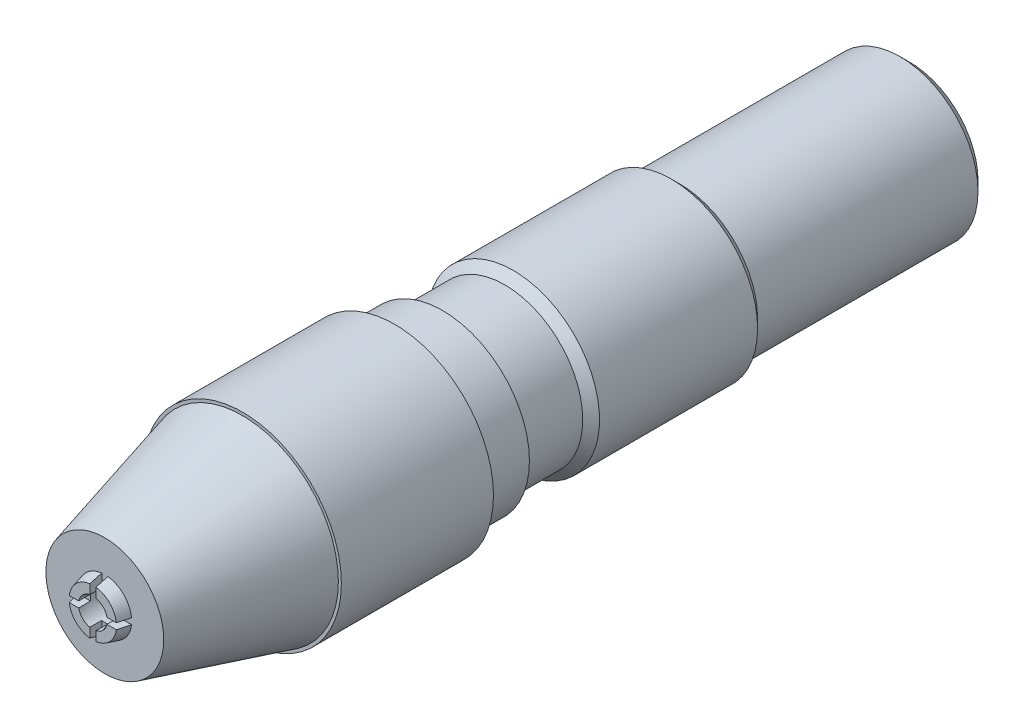
ISO-10303-21;
HEADER;
FILE_DESCRIPTION(('STEP AP214'),'2;1');
FILE_NAME('part.step','',(''),(''),'','','');
FILE_SCHEMA(('AUTOMOTIVE_DESIGN { 1 0 10303 214 1 1 1 1 }'));
ENDSEC;
DATA;
#1=APPLICATION_CONTEXT('core data for automotive mechanical design processes');
#2=APPLICATION_PROTOCOL_DEFINITION('international standard','automotive_design',2000,#1);
#3=PRODUCT_CONTEXT('',#1,'mechanical');
#4=PRODUCT('Part','Part','',(#3));
#5=PRODUCT_RELATED_PRODUCT_CATEGORY('part','',(#4));
#6=PRODUCT_DEFINITION_FORMATION('','',#4);
#7=PRODUCT_DEFINITION_CONTEXT('part definition',#1,'design');
#8=PRODUCT_DEFINITION('design','',#6,#7);
#9=PRODUCT_DEFINITION_SHAPE('','',#8);
#10=(LENGTH_UNIT() NAMED_UNIT(*) SI_UNIT(.MILLI.,.METRE.));
#11=(NAMED_UNIT(*) PLANE_ANGLE_UNIT() SI_UNIT($,.RADIAN.));
#12=(NAMED_UNIT(*) SI_UNIT($,.STERADIAN.) SOLID_ANGLE_UNIT());
#13=UNCERTAINTY_MEASURE_WITH_UNIT(LENGTH_MEASURE(1.E-05),#10,'distance_accuracy_value','');
#14=(GEOMETRIC_REPRESENTATION_CONTEXT(3) GLOBAL_UNCERTAINTY_ASSIGNED_CONTEXT((#13)) GLOBAL_UNIT_ASSIGNED_CONTEXT((#10,
#11,#12)) REPRESENTATION_CONTEXT('',''));
#15=CARTESIAN_POINT('',(0.,0.,0.));
#16=DIRECTION('',(0.,0.,1.));
#17=DIRECTION('',(1.,0.,0.));
#18=AXIS2_PLACEMENT_3D('',#15,#16,#17);
#19=CARTESIAN_POINT('',(0.,0.,33.6));
#20=DIRECTION('',(0.,0.,-1.));
#21=DIRECTION('',(1.,0.,0.));
#22=AXIS2_PLACEMENT_3D('',#19,#20,#21);
#23=CONICAL_SURFACE('',#22,1.125,0.26179938779915);
#24=CARTESIAN_POINT('',(1.52694377281968,0.127,32.0802486933022));
#25=CARTESIAN_POINT('',(1.45227874622724,0.127,32.3579168634142));
#26=CARTESIAN_POINT('',(1.3775911679959,0.127,32.6355789898778));
#27=CARTESIAN_POINT('',(1.22809970511908,0.127,33.1908716971153));
#28=CARTESIAN_POINT('',(1.15329582056319,0.127,33.4685022779133));
#29=CARTESIAN_POINT('',(1.00350036372481,0.127,34.0237130981265));
#30=CARTESIAN_POINT('',(0.928508791283457,0.127,34.3012933374989));
#31=CARTESIAN_POINT('',(0.815735396256075,0.127,34.7175863820948));
#32=CARTESIAN_POINT('',(0.778096576825201,0.127,34.856337899722));
#33=CARTESIAN_POINT('',(0.702661835456821,0.127,35.1337982869867));
#34=CARTESIAN_POINT('',(0.664865913438249,0.127,35.2725071566022));
#35=CARTESIAN_POINT('',(0.62696057606872,0.127,35.4111862107595));
#36=B_SPLINE_CURVE_WITH_KNOTS('',3,(#24,#25,#26,#27,#28,#29,#30,#31,#32,#33,#34,#35),
.UNSPECIFIED.,.F.,.F.,(4,2,2,2,2,4),(0.,0.862595128116384,1.72518959207756,2.58778478643162,
3.01908272670163,3.45038088955431),.UNSPECIFIED.);
#37=CARTESIAN_POINT('',(1.1178085703733,0.127,33.6));
#38=VERTEX_POINT('',#37);
#39=CARTESIAN_POINT('',(0.982854186004266,0.127,34.1));
#40=VERTEX_POINT('',#39);
#41=EDGE_CURVE('E456',#38,#40,#36,.T.);
#42=ORIENTED_EDGE('',*,*,#41,.F.);
#43=CARTESIAN_POINT('',(0.,0.,33.6));
#44=DIRECTION('',(0.,0.,1.));
#45=DIRECTION('',(1.,0.,0.));
#46=AXIS2_PLACEMENT_3D('',#43,#44,#45);
#47=CIRCLE('',#46,1.125);
#48=CARTESIAN_POINT('',(0.127,1.1178085703733,33.6));
#49=VERTEX_POINT('',#48);
#50=EDGE_CURVE('E273',#38,#49,#47,.T.);
#51=ORIENTED_EDGE('',*,*,#50,.T.);
#52=CARTESIAN_POINT('',(0.127,0.601834770500935,35.5030149332084));
#53=CARTESIAN_POINT('',(0.127,0.644839569806814,35.3459199452708));
#54=CARTESIAN_POINT('',(0.127,0.687692951729256,35.1887836667116));
#55=CARTESIAN_POINT('',(0.127,0.773188124812799,34.8744536668195));
#56=CARTESIAN_POINT('',(0.127,0.815829916137058,34.7172599455311));
#57=CARTESIAN_POINT('',(0.127,0.917802220550908,34.3407816957723));
#58=CARTESIAN_POINT('',(0.127,0.977075881718677,34.1214817837702));
#59=CARTESIAN_POINT('',(0.127,1.10833509558951,33.6352591502015));
#60=CARTESIAN_POINT('',(0.127,1.18028831663031,33.3683277037445));
#61=CARTESIAN_POINT('',(0.127,1.32407353817755,32.8344323970499));
#62=CARTESIAN_POINT('',(0.127,1.3959055387851,32.5674685368395));
#63=CARTESIAN_POINT('',(0.127,1.46771592416519,32.3004989030254));
#64=B_SPLINE_CURVE_WITH_KNOTS('',3,(#52,#53,#54,#55,#56,#57,#58,#59,#60,#61,#62,#63),
.UNSPECIFIED.,.F.,.F.,(4,2,2,2,2,4),(0.,0.488624543896328,0.977248710951746,1.65875607166697,
2.48813349090421,3.31751021817905),.UNSPECIFIED.);
#65=CARTESIAN_POINT('',(0.127,0.982854186004266,34.1));
#66=VERTEX_POINT('',#65);
#67=EDGE_CURVE('E439',#66,#49,#64,.T.);
#68=ORIENTED_EDGE('',*,*,#67,.F.);
#69=CARTESIAN_POINT('',(0.,0.,34.1));
#70=DIRECTION('',(0.,0.,1.));
#71=DIRECTION('',(1.,0.,0.));
#72=AXIS2_PLACEMENT_3D('',#69,#70,#71);
#73=CIRCLE('',#72,0.991025403784438);
#74=EDGE_CURVE('E280',#40,#66,#73,.T.);
#75=ORIENTED_EDGE('',*,*,#74,.F.);
#76=EDGE_LOOP('',(#42,#51,#68,#75));
#77=FACE_BOUND('',#76,.T.);
#78=ADVANCED_FACE('F38',(#77),#23,.T.);
#79=CARTESIAN_POINT('',(0.,0.,34.1));
#80=DIRECTION('',(0.,0.,1.));
#81=DIRECTION('',(1.,0.,0.));
#82=AXIS2_PLACEMENT_3D('',#79,#80,#81);
#83=PLANE('',#82);
#84=CARTESIAN_POINT('',(0.,0.,34.1));
#85=DIRECTION('',(0.,0.,1.));
#86=DIRECTION('',(1.,0.,0.));
#87=AXIS2_PLACEMENT_3D('',#84,#85,#86);
#88=CIRCLE('',#87,0.602413808335125);
#89=CARTESIAN_POINT('',(0.127,0.588874686561435,34.1));
#90=VERTEX_POINT('',#89);
#91=CARTESIAN_POINT('',(0.588874686561435,0.127,34.1));
#92=VERTEX_POINT('',#91);
#93=EDGE_CURVE('E176',#90,#92,#88,.F.);
#94=ORIENTED_EDGE('',*,*,#93,.T.);
#95=DIRECTION('',(1.,0.,0.));
#96=VECTOR('',#95,1.);
#97=CARTESIAN_POINT('',(-2.08035132850745,0.127,34.1));
#98=LINE('',#97,#96);
#99=EDGE_CURVE('E342',#92,#40,#98,.T.);
#100=ORIENTED_EDGE('',*,*,#99,.T.);
#101=ORIENTED_EDGE('',*,*,#74,.T.);
#102=DIRECTION('',(0.,-1.,0.));
#103=VECTOR('',#102,1.);
#104=CARTESIAN_POINT('',(0.127,0.,34.1));
#105=LINE('',#104,#103);
#106=EDGE_CURVE('E181',#66,#90,#105,.T.);
#107=ORIENTED_EDGE('',*,*,#106,.T.);
#108=EDGE_LOOP('',(#94,#100,#101,#107));
#109=FACE_BOUND('',#108,.T.);
#110=ADVANCED_FACE('F224',(#109),#83,.T.);
#111=CARTESIAN_POINT('',(-0.62696057606872,0.127,35.4111862107595));
#112=CARTESIAN_POINT('',(-0.671617188551801,0.127,35.2477882704118));
#113=CARTESIAN_POINT('',(-0.716128755964168,0.127,35.0843508302516));
#114=CARTESIAN_POINT('',(-0.804949111535813,0.127,34.7574209544264));
#115=CARTESIAN_POINT('',(-0.849257899827911,0.127,34.5939285187975));
#116=CARTESIAN_POINT('',(-0.955235062396902,0.127,34.2023422186737));
#117=CARTESIAN_POINT('',(-1.01684886147507,0.127,33.9742335976866));
#118=CARTESIAN_POINT('',(-1.15329704633582,0.127,33.4685023975448));
#119=CARTESIAN_POINT('',(-1.22810040088634,0.127,33.1908714489486));
#120=CARTESIAN_POINT('',(-1.37759069314615,0.127,32.6355784167316));
#121=CARTESIAN_POINT('',(-1.45227763093794,0.127,32.3579163331329));
#122=CARTESIAN_POINT('',(-1.52694377281968,0.127,32.0802486933022));
#123=B_SPLINE_CURVE_WITH_KNOTS('',3,(#111,#112,#113,#114,#115,#116,#117,#118,#119,#120,#121,
#122),.UNSPECIFIED.,.F.,.F.,(4,2,2,2,2,4),(0.,0.508170873106861,1.01634141331268,
1.72519129378873,2.58778639562883,3.45038088586624),.UNSPECIFIED.);
#124=CARTESIAN_POINT('',(-0.982854186004266,0.127,34.1));
#125=VERTEX_POINT('',#124);
#126=CARTESIAN_POINT('',(-1.1178085703733,0.127,33.6));
#127=VERTEX_POINT('',#126);
#128=EDGE_CURVE('E466',#125,#127,#123,.T.);
#129=ORIENTED_EDGE('',*,*,#128,.F.);
#130=CARTESIAN_POINT('',(-0.127,0.982854186004266,34.1));
#131=VERTEX_POINT('',#130);
#132=EDGE_CURVE('E287',#131,#125,#73,.T.);
#133=ORIENTED_EDGE('',*,*,#132,.F.);
#134=CARTESIAN_POINT('',(-0.127,0.601834770500935,35.5030149332084));
#135=CARTESIAN_POINT('',(-0.127,0.644839569806814,35.3459199452708));
#136=CARTESIAN_POINT('',(-0.127,0.687692951729256,35.1887836667116));
#137=CARTESIAN_POINT('',(-0.127,0.773188124812799,34.8744536668195));
#138=CARTESIAN_POINT('',(-0.127,0.815829916137058,34.7172599455311));
#139=CARTESIAN_POINT('',(-0.127,0.917802220550908,34.3407816957723));
#140=CARTESIAN_POINT('',(-0.127,0.977075881718677,34.1214817837702));
#141=CARTESIAN_POINT('',(-0.127,1.10833509558951,33.6352591502015));
#142=CARTESIAN_POINT('',(-0.127,1.18028831663031,33.3683277037445));
#143=CARTESIAN_POINT('',(-0.127,1.32407353817755,32.8344323970499));
#144=CARTESIAN_POINT('',(-0.127,1.3959055387851,32.5674685368395));
#145=CARTESIAN_POINT('',(-0.127,1.46771592416519,32.3004989030254));
#146=B_SPLINE_CURVE_WITH_KNOTS('',3,(#134,#135,#136,#137,#138,#139,#140,#141,#142,#143,#144,
#145),.UNSPECIFIED.,.F.,.F.,(4,2,2,2,2,4),(0.,0.488624543896328,0.977248710951746,
1.65875607166697,2.48813349090421,3.31751021817905),.UNSPECIFIED.);
#147=CARTESIAN_POINT('',(-0.127,1.1178085703733,33.6));
#148=VERTEX_POINT('',#147);
#149=EDGE_CURVE('E67',#131,#148,#146,.T.);
#150=ORIENTED_EDGE('',*,*,#149,.T.);
#151=EDGE_CURVE('E275',#148,#127,#47,.T.);
#152=ORIENTED_EDGE('',*,*,#151,.T.);
#153=EDGE_LOOP('',(#129,#133,#150,#152));
#154=FACE_BOUND('',#153,.T.);
#155=ADVANCED_FACE('F227',(#154),#23,.T.);
#156=CARTESIAN_POINT('',(-0.588874686561435,0.127,34.1));
#157=VERTEX_POINT('',#156);
#158=CARTESIAN_POINT('',(-0.127,0.588874686561435,34.1));
#159=VERTEX_POINT('',#158);
#160=EDGE_CURVE('E334',#157,#159,#88,.F.);
#161=ORIENTED_EDGE('',*,*,#160,.T.);
#162=DIRECTION('',(0.,-1.,0.));
#163=VECTOR('',#162,1.);
#164=CARTESIAN_POINT('',(-0.127,0.,34.1));
#165=LINE('',#164,#163);
#166=EDGE_CURVE('E182',#131,#159,#165,.T.);
#167=ORIENTED_EDGE('',*,*,#166,.F.);
#168=ORIENTED_EDGE('',*,*,#132,.T.);
#169=EDGE_CURVE('E344',#125,#157,#98,.T.);
#170=ORIENTED_EDGE('',*,*,#169,.T.);
#171=EDGE_LOOP('',(#161,#167,#168,#170));
#172=FACE_BOUND('',#171,.T.);
#173=ADVANCED_FACE('F234',(#172),#83,.T.);
#174=CARTESIAN_POINT('',(0.127,2.18502309346412,28.9090568149624));
#175=DIRECTION('',(-1.,0.,0.));
#176=DIRECTION('',(0.,0.,1.));
#177=AXIS2_PLACEMENT_3D('',#174,#175,#176);
#178=PLANE('',#177);
#179=CARTESIAN_POINT('',(0.127,0.580651528027783,35.0208133824793));
#180=CARTESIAN_POINT('',(0.127,0.584160501595592,34.6280050532015));
#181=CARTESIAN_POINT('',(0.127,0.587668098484079,34.2351967116354));
#182=CARTESIAN_POINT('',(0.127,0.594635244174312,33.4546544563337));
#183=CARTESIAN_POINT('',(0.127,0.59809482831528,33.0669205429136));
#184=CARTESIAN_POINT('',(0.127,0.601553071116144,32.6791866175207));
#185=B_SPLINE_CURVE_WITH_KNOTS('',3,(#179,#180,#181,#182,#183,#184),.UNSPECIFIED.,.F.,.F.,(4,2,
4),(0.,1.17847200558975,2.34172004751647),.UNSPECIFIED.);
#186=CARTESIAN_POINT('',(0.127,0.593337696163707,33.6));
#187=VERTEX_POINT('',#186);
#188=EDGE_CURVE('E346',#90,#187,#185,.T.);
#189=ORIENTED_EDGE('',*,*,#188,.F.);
#190=ORIENTED_EDGE('',*,*,#106,.F.);
#191=ORIENTED_EDGE('',*,*,#67,.T.);
#192=DIRECTION('',(0.,1.,0.));
#193=VECTOR('',#192,1.);
#194=CARTESIAN_POINT('',(0.127,2.18502309346412,33.6));
#195=LINE('',#194,#193);
#196=EDGE_CURVE('E453',#187,#49,#195,.T.);
#197=ORIENTED_EDGE('',*,*,#196,.F.);
#198=EDGE_LOOP('',(#189,#190,#191,#197));
#199=FACE_BOUND('',#198,.T.);
#200=ADVANCED_FACE('F262',(#199),#178,.T.);
#201=CARTESIAN_POINT('',(-0.127,2.18502309346412,28.9090568149624));
#202=DIRECTION('',(-1.,0.,0.));
#203=DIRECTION('',(0.,0.,1.));
#204=AXIS2_PLACEMENT_3D('',#201,#202,#203);
#205=PLANE('',#204);
#206=ORIENTED_EDGE('',*,*,#166,.T.);
#207=CARTESIAN_POINT('',(-0.127,0.580651528027783,35.0208133824793));
#208=CARTESIAN_POINT('',(-0.127,0.584160501595592,34.6280050532015));
#209=CARTESIAN_POINT('',(-0.127,0.587668098484079,34.2351967116354));
#210=CARTESIAN_POINT('',(-0.127,0.594635244174312,33.4546544563337));
#211=CARTESIAN_POINT('',(-0.127,0.59809482831528,33.0669205429136));
#212=CARTESIAN_POINT('',(-0.127,0.601553071116144,32.6791866175207));
#213=B_SPLINE_CURVE_WITH_KNOTS('',3,(#207,#208,#209,#210,#211,#212),.UNSPECIFIED.,.F.,.F.,(4,2,
4),(0.,1.17847200558975,2.34172004751647),.UNSPECIFIED.);
#214=CARTESIAN_POINT('',(-0.127,0.593337696163707,33.6));
#215=VERTEX_POINT('',#214);
#216=EDGE_CURVE('E412',#159,#215,#213,.T.);
#217=ORIENTED_EDGE('',*,*,#216,.T.);
#218=DIRECTION('',(0.,1.,0.));
#219=VECTOR('',#218,1.);
#220=CARTESIAN_POINT('',(-0.127,2.18502309346412,33.6));
#221=LINE('',#220,#219);
#222=EDGE_CURVE('E465',#215,#148,#221,.T.);
#223=ORIENTED_EDGE('',*,*,#222,.T.);
#224=ORIENTED_EDGE('',*,*,#149,.F.);
#225=EDGE_LOOP('',(#206,#217,#223,#224));
#226=FACE_BOUND('',#225,.T.);
#227=ADVANCED_FACE('F255',(#226),#205,.F.);
#228=CARTESIAN_POINT('',(0.127,-1.1178085703733,33.6));
#229=VERTEX_POINT('',#228);
#230=CARTESIAN_POINT('',(1.1178085703733,-0.127,33.6));
#231=VERTEX_POINT('',#230);
#232=EDGE_CURVE('E268',#229,#231,#47,.T.);
#233=ORIENTED_EDGE('',*,*,#232,.T.);
#234=CARTESIAN_POINT('',(1.52694377281968,-0.127,32.0802486933022));
#235=CARTESIAN_POINT('',(1.45227874622724,-0.127,32.3579168634142));
#236=CARTESIAN_POINT('',(1.3775911679959,-0.127,32.6355789898778));
#237=CARTESIAN_POINT('',(1.22809970511908,-0.127,33.1908716971153));
#238=CARTESIAN_POINT('',(1.15329582056319,-0.127,33.4685022779133));
#239=CARTESIAN_POINT('',(1.00350036372481,-0.127,34.0237130981265));
#240=CARTESIAN_POINT('',(0.928508791283457,-0.127,34.3012933374989));
#241=CARTESIAN_POINT('',(0.815735396256075,-0.127,34.7175863820948));
#242=CARTESIAN_POINT('',(0.778096576825201,-0.127,34.856337899722));
#243=CARTESIAN_POINT('',(0.702661835456821,-0.127,35.1337982869867));
#244=CARTESIAN_POINT('',(0.664865913438249,-0.127,35.2725071566022));
#245=CARTESIAN_POINT('',(0.62696057606872,-0.127,35.4111862107595));
#246=B_SPLINE_CURVE_WITH_KNOTS('',3,(#234,#235,#236,#237,#238,#239,#240,#241,#242,#243,#244,
#245),.UNSPECIFIED.,.F.,.F.,(4,2,2,2,2,4),(0.,0.862595128116384,1.72518959207756,
2.58778478643162,3.01908272670163,3.45038088955431),.UNSPECIFIED.);
#247=CARTESIAN_POINT('',(0.982854186004266,-0.127,34.1));
#248=VERTEX_POINT('',#247);
#249=EDGE_CURVE('E269',#231,#248,#246,.T.);
#250=ORIENTED_EDGE('',*,*,#249,.T.);
#251=CARTESIAN_POINT('',(0.127,-0.982854186004266,34.1));
#252=VERTEX_POINT('',#251);
#253=EDGE_CURVE('E283',#252,#248,#73,.T.);
#254=ORIENTED_EDGE('',*,*,#253,.F.);
#255=CARTESIAN_POINT('',(0.127,-1.46771592416519,32.3004989030254));
#256=CARTESIAN_POINT('',(0.127,-1.39590669999338,32.5674691096526));
#257=CARTESIAN_POINT('',(0.127,-1.3240740251528,32.834433031674));
#258=CARTESIAN_POINT('',(0.127,-1.1802875798174,33.3683279976573));
#259=CARTESIAN_POINT('',(0.127,-1.10833380943221,33.6352590416487));
#260=CARTESIAN_POINT('',(0.127,-0.964230777253068,34.1690686917328));
#261=CARTESIAN_POINT('',(0.127,-0.892081515264477,34.4359472977731));
#262=CARTESIAN_POINT('',(0.127,-0.783559461220737,34.8361845573283));
#263=CARTESIAN_POINT('',(0.127,-0.74733573269253,34.969583597938));
#264=CARTESIAN_POINT('',(0.127,-0.674724336196296,35.2363371270618));
#265=CARTESIAN_POINT('',(0.127,-0.638336668128615,35.3696916155487));
#266=CARTESIAN_POINT('',(0.127,-0.601834770500935,35.5030149332084));
#267=B_SPLINE_CURVE_WITH_KNOTS('',3,(#255,#256,#257,#258,#259,#260,#261,#262,#263,#264,#265,
#266),.UNSPECIFIED.,.F.,.F.,(4,2,2,2,2,4),(0.,0.829377448445653,1.65875414651213,
2.48813167068975,2.90282082049476,3.3175102224111),.UNSPECIFIED.);
#268=EDGE_CURVE('E179',#229,#252,#267,.T.);
#269=ORIENTED_EDGE('',*,*,#268,.F.);
#270=EDGE_LOOP('',(#233,#250,#254,#269));
#271=FACE_BOUND('',#270,.T.);
#272=ADVANCED_FACE('F241',(#271),#23,.T.);
#273=CARTESIAN_POINT('',(0.588874686561433,-0.127,34.1));
#274=VERTEX_POINT('',#273);
#275=CARTESIAN_POINT('',(0.127,-0.588874686561435,34.1));
#276=VERTEX_POINT('',#275);
#277=EDGE_CURVE('E60',#274,#276,#88,.F.);
#278=ORIENTED_EDGE('',*,*,#277,.T.);
#279=EDGE_CURVE('E170',#276,#252,#105,.T.);
#280=ORIENTED_EDGE('',*,*,#279,.T.);
#281=ORIENTED_EDGE('',*,*,#253,.T.);
#282=DIRECTION('',(1.,0.,0.));
#283=VECTOR('',#282,1.);
#284=CARTESIAN_POINT('',(-2.08035132850745,-0.127,34.1));
#285=LINE('',#284,#283);
#286=EDGE_CURVE('E172',#274,#248,#285,.T.);
#287=ORIENTED_EDGE('',*,*,#286,.F.);
#288=EDGE_LOOP('',(#278,#280,#281,#287));
#289=FACE_BOUND('',#288,.T.);
#290=ADVANCED_FACE('F168',(#289),#83,.T.);
#291=CARTESIAN_POINT('',(0.,0.,33.6));
#292=DIRECTION('',(0.,0.,1.));
#293=DIRECTION('',(1.,0.,0.));
#294=AXIS2_PLACEMENT_3D('',#291,#292,#293);
#295=PLANE('',#294);
#296=CARTESIAN_POINT('',(0.,0.,33.6));
#297=DIRECTION('',(0.,0.,1.));
#298=DIRECTION('',(1.,0.,0.));
#299=AXIS2_PLACEMENT_3D('',#296,#297,#298);
#300=CIRCLE('',#299,0.606777242230504);
#301=EDGE_CURVE('E164',#187,#215,#300,.T.);
#302=ORIENTED_EDGE('',*,*,#301,.F.);
#303=ORIENTED_EDGE('',*,*,#196,.T.);
#304=ORIENTED_EDGE('',*,*,#50,.F.);
#305=DIRECTION('',(-1.,0.,0.));
#306=VECTOR('',#305,1.);
#307=CARTESIAN_POINT('',(-2.08035132850745,0.127,33.6));
#308=LINE('',#307,#306);
#309=CARTESIAN_POINT('',(0.593337696163707,0.127,33.6));
#310=VERTEX_POINT('',#309);
#311=EDGE_CURVE('E461',#38,#310,#308,.T.);
#312=ORIENTED_EDGE('',*,*,#311,.T.);
#313=CARTESIAN_POINT('',(0.59333769616371,-0.127,33.6));
#314=VERTEX_POINT('',#313);
#315=EDGE_CURVE('E173',#314,#310,#300,.T.);
#316=ORIENTED_EDGE('',*,*,#315,.F.);
#317=DIRECTION('',(-1.,0.,0.));
#318=VECTOR('',#317,1.);
#319=CARTESIAN_POINT('',(-2.08035132850745,-0.127,33.6));
#320=LINE('',#319,#318);
#321=EDGE_CURVE('E356',#231,#314,#320,.T.);
#322=ORIENTED_EDGE('',*,*,#321,.F.);
#323=ORIENTED_EDGE('',*,*,#232,.F.);
#324=CARTESIAN_POINT('',(0.127,-0.593337696163707,33.6));
#325=VERTEX_POINT('',#324);
#326=EDGE_CURVE('E463',#229,#325,#195,.T.);
#327=ORIENTED_EDGE('',*,*,#326,.T.);
#328=CARTESIAN_POINT('',(-0.127,-0.59333769616371,33.6));
#329=VERTEX_POINT('',#328);
#330=EDGE_CURVE('E160',#329,#325,#300,.T.);
#331=ORIENTED_EDGE('',*,*,#330,.F.);
#332=CARTESIAN_POINT('',(-0.127,-1.1178085703733,33.6));
#333=VERTEX_POINT('',#332);
#334=EDGE_CURVE('E472',#333,#329,#221,.T.);
#335=ORIENTED_EDGE('',*,*,#334,.F.);
#336=CARTESIAN_POINT('',(-1.1178085703733,-0.127,33.6));
#337=VERTEX_POINT('',#336);
#338=EDGE_CURVE('E272',#337,#333,#47,.T.);
#339=ORIENTED_EDGE('',*,*,#338,.F.);
#340=CARTESIAN_POINT('',(-0.593337696163707,-0.127,33.6));
#341=VERTEX_POINT('',#340);
#342=EDGE_CURVE('E348',#341,#337,#320,.T.);
#343=ORIENTED_EDGE('',*,*,#342,.F.);
#344=CARTESIAN_POINT('',(-0.593337696163708,0.127,33.6));
#345=VERTEX_POINT('',#344);
#346=EDGE_CURVE('E380',#345,#341,#300,.T.);
#347=ORIENTED_EDGE('',*,*,#346,.F.);
#348=EDGE_CURVE('E475',#345,#127,#308,.T.);
#349=ORIENTED_EDGE('',*,*,#348,.T.);
#350=ORIENTED_EDGE('',*,*,#151,.F.);
#351=ORIENTED_EDGE('',*,*,#222,.F.);
#352=EDGE_LOOP('',(#302,#303,#304,#312,#316,#322,#323,#327,#331,#335,#339,#343,#347,#349,#350,#351));
#353=FACE_BOUND('',#352,.T.);
#354=CARTESIAN_POINT('',(0.,0.,33.6));
#355=DIRECTION('',(0.,0.,1.));
#356=DIRECTION('',(1.,0.,0.));
#357=AXIS2_PLACEMENT_3D('',#354,#355,#356);
#358=CIRCLE('',#357,2.45929214352104);
#359=CARTESIAN_POINT('',(2.45929214352104,0.,33.6));
#360=VERTEX_POINT('',#359);
#361=EDGE_CURVE('E299',#360,#360,#358,.T.);
#362=ORIENTED_EDGE('',*,*,#361,.T.);
#363=EDGE_LOOP('',(#362));
#364=FACE_BOUND('',#363,.T.);
#365=ADVANCED_FACE('F261',(#353,#364),#295,.T.);
#366=CARTESIAN_POINT('',(0.,0.,27.85));
#367=DIRECTION('',(0.,0.,1.));
#368=DIRECTION('',(1.,0.,0.));
#369=AXIS2_PLACEMENT_3D('',#366,#367,#368);
#370=PLANE('',#369);
#371=CARTESIAN_POINT('',(0.,0.,27.85));
#372=DIRECTION('',(0.,0.,1.));
#373=DIRECTION('',(1.,0.,0.));
#374=AXIS2_PLACEMENT_3D('',#371,#372,#373);
#375=CIRCLE('',#374,4.125);
#376=CARTESIAN_POINT('',(4.125,0.,27.85));
#377=VERTEX_POINT('',#376);
#378=EDGE_CURVE('E307',#377,#377,#375,.T.);
#379=ORIENTED_EDGE('',*,*,#378,.T.);
#380=EDGE_LOOP('',(#379));
#381=FACE_BOUND('',#380,.T.);
#382=CARTESIAN_POINT('',(0.,0.,27.85));
#383=DIRECTION('',(0.,0.,1.));
#384=DIRECTION('',(1.,0.,0.));
#385=AXIS2_PLACEMENT_3D('',#382,#383,#384);
#386=CIRCLE('',#385,4.);
#387=CARTESIAN_POINT('',(4.,0.,27.85));
#388=VERTEX_POINT('',#387);
#389=EDGE_CURVE('E294',#388,#388,#386,.T.);
#390=ORIENTED_EDGE('',*,*,#389,.F.);
#391=EDGE_LOOP('',(#390));
#392=FACE_BOUND('',#391,.T.);
#393=ADVANCED_FACE('F541',(#381,#392),#370,.T.);
#394=CARTESIAN_POINT('',(0.,0.,10.));
#395=DIRECTION('',(0.,0.,-1.));
#396=DIRECTION('',(-1.,0.,0.));
#397=AXIS2_PLACEMENT_3D('',#394,#395,#396);
#398=CYLINDRICAL_SURFACE('',#397,3.25);
#399=CARTESIAN_POINT('',(0.,0.,9.6));
#400=DIRECTION('',(0.,0.,1.));
#401=DIRECTION('',(1.,0.,0.));
#402=AXIS2_PLACEMENT_3D('',#399,#400,#401);
#403=CIRCLE('',#402,3.25);
#404=CARTESIAN_POINT('',(3.25,0.,9.6));
#405=VERTEX_POINT('',#404);
#406=EDGE_CURVE('E195',#405,#405,#403,.F.);
#407=ORIENTED_EDGE('',*,*,#406,.T.);
#408=EDGE_LOOP('',(#407));
#409=FACE_BOUND('',#408,.T.);
#410=CARTESIAN_POINT('',(0.,0.,0.400000000000001));
#411=DIRECTION('',(0.,0.,1.));
#412=DIRECTION('',(1.,0.,0.));
#413=AXIS2_PLACEMENT_3D('',#410,#411,#412);
#414=CIRCLE('',#413,3.25);
#415=CARTESIAN_POINT('',(3.25,0.,0.400000000000001));
#416=VERTEX_POINT('',#415);
#417=EDGE_CURVE('E192',#416,#416,#414,.T.);
#418=ORIENTED_EDGE('',*,*,#417,.T.);
#419=EDGE_LOOP('',(#418));
#420=FACE_BOUND('',#419,.T.);
#421=ADVANCED_FACE('F527',(#409,#420),#398,.T.);
#422=CARTESIAN_POINT('',(0.,0.,0.));
#423=DIRECTION('',(0.,0.,1.));
#424=DIRECTION('',(1.,0.,0.));
#425=AXIS2_PLACEMENT_3D('',#422,#423,#424);
#426=PLANE('',#425);
#427=CARTESIAN_POINT('',(0.,0.,0.));
#428=DIRECTION('',(0.,0.,-1.));
#429=DIRECTION('',(-1.,0.,0.));
#430=AXIS2_PLACEMENT_3D('',#427,#428,#429);
#431=CIRCLE('',#430,0.9);
#432=CARTESIAN_POINT('',(-0.9,0.,0.));
#433=VERTEX_POINT('',#432);
#434=EDGE_CURVE('E486',#433,#433,#431,.T.);
#435=ORIENTED_EDGE('',*,*,#434,.F.);
#436=EDGE_LOOP('',(#435));
#437=FACE_BOUND('',#436,.T.);
#438=CARTESIAN_POINT('',(0.,0.,0.));
#439=DIRECTION('',(0.,0.,1.));
#440=DIRECTION('',(1.,0.,0.));
#441=AXIS2_PLACEMENT_3D('',#438,#439,#440);
#442=CIRCLE('',#441,2.85);
#443=CARTESIAN_POINT('',(2.85,0.,0.));
#444=VERTEX_POINT('',#443);
#445=EDGE_CURVE('E198',#444,#444,#442,.F.);
#446=ORIENTED_EDGE('',*,*,#445,.T.);
#447=EDGE_LOOP('',(#446));
#448=FACE_BOUND('',#447,.T.);
#449=ADVANCED_FACE('F522',(#437,#448),#426,.F.);
#450=CARTESIAN_POINT('',(0.,0.,16.5));
#451=DIRECTION('',(0.,0.,-1.));
#452=DIRECTION('',(-1.,0.,0.));
#453=AXIS2_PLACEMENT_3D('',#450,#451,#452);
#454=CYLINDRICAL_SURFACE('',#453,3.6);
#455=CARTESIAN_POINT('',(0.,0.,9.94999999999999));
#456=DIRECTION('',(0.,0.,1.));
#457=DIRECTION('',(1.,0.,0.));
#458=AXIS2_PLACEMENT_3D('',#455,#456,#457);
#459=CIRCLE('',#458,3.6);
#460=CARTESIAN_POINT('',(-3.6,0.,9.94999999999999));
#461=VERTEX_POINT('',#460);
#462=EDGE_CURVE('E53',#461,#461,#459,.T.);
#463=CARTESIAN_POINT('',(0.,0.,16.55));
#464=DIRECTION('',(0.,0.,-1.));
#465=DIRECTION('',(-1.,0.,0.));
#466=AXIS2_PLACEMENT_3D('',#463,#464,#465);
#467=CIRCLE('',#466,3.6);
#468=CARTESIAN_POINT('',(-3.6,0.,16.55));
#469=VERTEX_POINT('',#468);
#470=EDGE_CURVE('E201',#469,#469,#467,.T.);
#471=CARTESIAN_POINT('',(-3.6,0.,9.94999999999999));
#472=CARTESIAN_POINT('',(-3.6,0.,10.01875));
#473=CARTESIAN_POINT('',(-3.6,0.,10.0875));
#474=CARTESIAN_POINT('',(-3.6,0.,10.225));
#475=CARTESIAN_POINT('',(-3.6,0.,10.29375));
#476=CARTESIAN_POINT('',(-3.6,0.,10.43125));
#477=CARTESIAN_POINT('',(-3.6,0.,10.5));
#478=CARTESIAN_POINT('',(-3.6,0.,10.6375));
#479=CARTESIAN_POINT('',(-3.6,0.,10.70625));
#480=CARTESIAN_POINT('',(-3.6,0.,10.84375));
#481=CARTESIAN_POINT('',(-3.6,0.,10.9125));
#482=CARTESIAN_POINT('',(-3.6,0.,11.05));
#483=CARTESIAN_POINT('',(-3.6,0.,11.11875));
#484=CARTESIAN_POINT('',(-3.6,0.,11.25625));
#485=CARTESIAN_POINT('',(-3.6,0.,11.325));
#486=CARTESIAN_POINT('',(-3.6,0.,11.4625));
#487=CARTESIAN_POINT('',(-3.6,0.,11.53125));
#488=CARTESIAN_POINT('',(-3.6,0.,11.66875));
#489=CARTESIAN_POINT('',(-3.6,0.,11.7375));
#490=CARTESIAN_POINT('',(-3.6,0.,11.875));
#491=CARTESIAN_POINT('',(-3.6,0.,11.94375));
#492=CARTESIAN_POINT('',(-3.6,0.,12.08125));
#493=CARTESIAN_POINT('',(-3.6,0.,12.15));
#494=CARTESIAN_POINT('',(-3.6,0.,12.2875));
#495=CARTESIAN_POINT('',(-3.6,0.,12.35625));
#496=CARTESIAN_POINT('',(-3.6,0.,12.49375));
#497=CARTESIAN_POINT('',(-3.6,0.,12.5625));
#498=CARTESIAN_POINT('',(-3.6,0.,12.7));
#499=CARTESIAN_POINT('',(-3.6,0.,12.76875));
#500=CARTESIAN_POINT('',(-3.6,0.,12.90625));
#501=CARTESIAN_POINT('',(-3.6,0.,12.975));
#502=CARTESIAN_POINT('',(-3.6,0.,13.1125));
#503=CARTESIAN_POINT('',(-3.6,0.,13.18125));
#504=CARTESIAN_POINT('',(-3.6,0.,13.31875));
#505=CARTESIAN_POINT('',(-3.6,0.,13.3875));
#506=CARTESIAN_POINT('',(-3.6,0.,13.525));
#507=CARTESIAN_POINT('',(-3.6,0.,13.59375));
#508=CARTESIAN_POINT('',(-3.6,0.,13.73125));
#509=CARTESIAN_POINT('',(-3.6,0.,13.8));
#510=CARTESIAN_POINT('',(-3.6,0.,13.9375));
#511=CARTESIAN_POINT('',(-3.6,0.,14.00625));
#512=CARTESIAN_POINT('',(-3.6,0.,14.14375));
#513=CARTESIAN_POINT('',(-3.6,0.,14.2125));
#514=CARTESIAN_POINT('',(-3.6,0.,14.35));
#515=CARTESIAN_POINT('',(-3.6,0.,14.41875));
#516=CARTESIAN_POINT('',(-3.6,0.,14.55625));
#517=CARTESIAN_POINT('',(-3.6,0.,14.625));
#518=CARTESIAN_POINT('',(-3.6,0.,14.7625));
#519=CARTESIAN_POINT('',(-3.6,0.,14.83125));
#520=CARTESIAN_POINT('',(-3.6,0.,14.96875));
#521=CARTESIAN_POINT('',(-3.6,0.,15.0375));
#522=CARTESIAN_POINT('',(-3.6,0.,15.175));
#523=CARTESIAN_POINT('',(-3.6,0.,15.24375));
#524=CARTESIAN_POINT('',(-3.6,0.,15.38125));
#525=CARTESIAN_POINT('',(-3.6,0.,15.45));
#526=CARTESIAN_POINT('',(-3.6,0.,15.5875));
#527=CARTESIAN_POINT('',(-3.6,0.,15.65625));
#528=CARTESIAN_POINT('',(-3.6,0.,15.79375));
#529=CARTESIAN_POINT('',(-3.6,0.,15.8625));
#530=CARTESIAN_POINT('',(-3.6,0.,16.));
#531=CARTESIAN_POINT('',(-3.6,0.,16.06875));
#532=CARTESIAN_POINT('',(-3.6,0.,16.20625));
#533=CARTESIAN_POINT('',(-3.6,0.,16.275));
#534=CARTESIAN_POINT('',(-3.6,0.,16.4125));
#535=CARTESIAN_POINT('',(-3.6,0.,16.48125));
#536=CARTESIAN_POINT('',(-3.6,0.,16.55));
#537=B_SPLINE_CURVE_WITH_KNOTS('',3,(#471,#472,#473,#474,#475,#476,#477,#478,#479,#480,#481,
#482,#483,#484,#485,#486,#487,#488,#489,#490,#491,#492,#493,#494,#495,#496,#497,#498,#499,#500,
#501,#502,#503,#504,#505,#506,#507,#508,#509,#510,#511,#512,#513,#514,#515,#516,#517,#518,#519,
#520,#521,#522,#523,#524,#525,#526,#527,#528,#529,#530,#531,#532,#533,#534,#535,#536),
.UNSPECIFIED.,.F.,.F.,(4,2,2,2,2,2,2,2,2,2,2,2,2,2,2,2,2,2,2,2,2,2,2,2,2,2,2,2,2,2,2,2,4),(0.,
0.20625,0.4125,0.618750000000001,0.825000000000001,1.03125,1.2375,1.44375,1.65,1.85625,
2.06250000000001,2.26875,2.475,2.68125,2.8875,3.09375000000001,3.30000000000001,
3.50625000000001,3.71250000000001,3.91875000000001,4.12500000000001,4.33125000000001,
4.53750000000001,4.74375000000001,4.95000000000001,5.15625000000001,5.36250000000001,
5.56875000000001,5.77500000000001,5.98125000000001,6.18750000000001,6.39375000000001,
6.60000000000001),.UNSPECIFIED.);
#538=EDGE_CURVE('BSEAM206',#461,#469,#537,.T.);
#539=ORIENTED_EDGE('',*,*,#462,.T.);
#540=ORIENTED_EDGE('',*,*,#470,.T.);
#541=ORIENTED_EDGE('',*,*,#538,.T.);
#542=ORIENTED_EDGE('',*,*,#538,.F.);
#543=EDGE_LOOP('',(#539,#541,#540,#542));
#544=FACE_BOUND('',#543,.T.);
#545=ADVANCED_FACE('F206',(#544),#454,.T.);
#546=CARTESIAN_POINT('',(0.,0.,19.5));
#547=DIRECTION('',(0.,0.,-1.));
#548=DIRECTION('',(-1.,0.,0.));
#549=AXIS2_PLACEMENT_3D('',#546,#547,#548);
#550=CYLINDRICAL_SURFACE('',#549,3.25);
#551=CARTESIAN_POINT('',(0.,0.,16.9));
#552=DIRECTION('',(0.,0.,1.));
#553=DIRECTION('',(1.,0.,0.));
#554=AXIS2_PLACEMENT_3D('',#551,#552,#553);
#555=CIRCLE('',#554,3.25);
#556=CARTESIAN_POINT('',(3.25,0.,16.9));
#557=VERTEX_POINT('',#556);
#558=EDGE_CURVE('E185',#557,#557,#555,.T.);
#559=ORIENTED_EDGE('',*,*,#558,.T.);
#560=EDGE_LOOP('',(#559));
#561=FACE_BOUND('',#560,.T.);
#562=CARTESIAN_POINT('',(0.,0.,19.5));
#563=DIRECTION('',(0.,0.,1.));
#564=DIRECTION('',(1.,0.,0.));
#565=AXIS2_PLACEMENT_3D('',#562,#563,#564);
#566=CIRCLE('',#565,3.25);
#567=CARTESIAN_POINT('',(3.25,0.,19.5));
#568=VERTEX_POINT('',#567);
#569=EDGE_CURVE('E318',#568,#568,#566,.T.);
#570=ORIENTED_EDGE('',*,*,#569,.F.);
#571=EDGE_LOOP('',(#570));
#572=FACE_BOUND('',#571,.T.);
#573=ADVANCED_FACE('F599',(#561,#572),#550,.T.);
#574=CARTESIAN_POINT('',(0.,0.,19.5));
#575=DIRECTION('',(0.,0.,1.));
#576=DIRECTION('',(1.,0.,0.));
#577=AXIS2_PLACEMENT_3D('',#574,#575,#576);
#578=PLANE('',#577);
#579=CARTESIAN_POINT('',(0.,0.,19.5));
#580=DIRECTION('',(0.,0.,1.));
#581=DIRECTION('',(1.,0.,0.));
#582=AXIS2_PLACEMENT_3D('',#579,#580,#581);
#583=CIRCLE('',#582,3.625);
#584=CARTESIAN_POINT('',(3.625,0.,19.5));
#585=VERTEX_POINT('',#584);
#586=EDGE_CURVE('E310',#585,#585,#583,.T.);
#587=ORIENTED_EDGE('',*,*,#586,.F.);
#588=EDGE_LOOP('',(#587));
#589=FACE_BOUND('',#588,.T.);
#590=ORIENTED_EDGE('',*,*,#569,.T.);
#591=EDGE_LOOP('',(#590));
#592=FACE_BOUND('',#591,.T.);
#593=ADVANCED_FACE('F604',(#589,#592),#578,.F.);
#594=CARTESIAN_POINT('',(0.,0.,21.5));
#595=DIRECTION('',(0.,0.,-1.));
#596=DIRECTION('',(-1.,0.,0.));
#597=AXIS2_PLACEMENT_3D('',#594,#595,#596);
#598=CYLINDRICAL_SURFACE('',#597,3.625);
#599=CARTESIAN_POINT('',(0.,0.,21.5));
#600=DIRECTION('',(0.,0.,1.));
#601=DIRECTION('',(1.,0.,0.));
#602=AXIS2_PLACEMENT_3D('',#599,#600,#601);
#603=CIRCLE('',#602,3.625);
#604=CARTESIAN_POINT('',(3.625,0.,21.5));
#605=VERTEX_POINT('',#604);
#606=EDGE_CURVE('E314',#605,#605,#603,.T.);
#607=ORIENTED_EDGE('',*,*,#606,.F.);
#608=EDGE_LOOP('',(#607));
#609=FACE_BOUND('',#608,.T.);
#610=ORIENTED_EDGE('',*,*,#586,.T.);
#611=EDGE_LOOP('',(#610));
#612=FACE_BOUND('',#611,.T.);
#613=ADVANCED_FACE('F670',(#609,#612),#598,.T.);
#614=CARTESIAN_POINT('',(0.,0.,21.5));
#615=DIRECTION('',(0.,0.,1.));
#616=DIRECTION('',(1.,0.,0.));
#617=AXIS2_PLACEMENT_3D('',#614,#615,#616);
#618=PLANE('',#617);
#619=CARTESIAN_POINT('',(0.,0.,21.5));
#620=DIRECTION('',(0.,0.,1.));
#621=DIRECTION('',(1.,0.,0.));
#622=AXIS2_PLACEMENT_3D('',#619,#620,#621);
#623=CIRCLE('',#622,4.125);
#624=CARTESIAN_POINT('',(4.125,0.,21.5));
#625=VERTEX_POINT('',#624);
#626=EDGE_CURVE('E304',#625,#625,#623,.T.);
#627=ORIENTED_EDGE('',*,*,#626,.F.);
#628=EDGE_LOOP('',(#627));
#629=FACE_BOUND('',#628,.T.);
#630=ORIENTED_EDGE('',*,*,#606,.T.);
#631=EDGE_LOOP('',(#630));
#632=FACE_BOUND('',#631,.T.);
#633=ADVANCED_FACE('F660',(#629,#632),#618,.F.);
#634=CARTESIAN_POINT('',(0.,0.,27.85));
#635=DIRECTION('',(0.,0.,-1.));
#636=DIRECTION('',(-1.,0.,0.));
#637=AXIS2_PLACEMENT_3D('',#634,#635,#636);
#638=CYLINDRICAL_SURFACE('',#637,4.125);
#639=ORIENTED_EDGE('',*,*,#378,.F.);
#640=EDGE_LOOP('',(#639));
#641=FACE_BOUND('',#640,.T.);
#642=ORIENTED_EDGE('',*,*,#626,.T.);
#643=EDGE_LOOP('',(#642));
#644=FACE_BOUND('',#643,.T.);
#645=ADVANCED_FACE('F250',(#641,#644),#638,.T.);
#646=CARTESIAN_POINT('',(0.,0.,27.85));
#647=DIRECTION('',(0.,0.,-1.));
#648=DIRECTION('',(1.,0.,0.));
#649=AXIS2_PLACEMENT_3D('',#646,#647,#648);
#650=CONICAL_SURFACE('',#649,4.,0.26179938779915);
#651=ORIENTED_EDGE('',*,*,#361,.F.);
#652=EDGE_LOOP('',(#651));
#653=FACE_BOUND('',#652,.T.);
#654=ORIENTED_EDGE('',*,*,#389,.T.);
#655=EDGE_LOOP('',(#654));
#656=FACE_BOUND('',#655,.T.);
#657=ADVANCED_FACE('F243',(#653,#656),#650,.T.);
#658=CARTESIAN_POINT('',(-0.982854186004266,-0.127,34.1));
#659=VERTEX_POINT('',#658);
#660=CARTESIAN_POINT('',(-0.127,-0.982854186004266,34.1));
#661=VERTEX_POINT('',#660);
#662=EDGE_CURVE('E284',#659,#661,#73,.T.);
#663=ORIENTED_EDGE('',*,*,#662,.F.);
#664=CARTESIAN_POINT('',(-0.62696057606872,-0.127,35.4111862107595));
#665=CARTESIAN_POINT('',(-0.671617188551801,-0.127,35.2477882704118));
#666=CARTESIAN_POINT('',(-0.716128755964168,-0.127,35.0843508302516));
#667=CARTESIAN_POINT('',(-0.804949111535813,-0.127,34.7574209544264));
#668=CARTESIAN_POINT('',(-0.849257899827911,-0.127,34.5939285187975));
#669=CARTESIAN_POINT('',(-0.955235062396902,-0.127,34.2023422186737));
#670=CARTESIAN_POINT('',(-1.01684886147507,-0.127,33.9742335976866));
#671=CARTESIAN_POINT('',(-1.15329704633582,-0.127,33.4685023975448));
#672=CARTESIAN_POINT('',(-1.22810040088634,-0.127,33.1908714489486));
#673=CARTESIAN_POINT('',(-1.37759069314615,-0.127,32.6355784167316));
#674=CARTESIAN_POINT('',(-1.45227763093794,-0.127,32.3579163331329));
#675=CARTESIAN_POINT('',(-1.52694377281968,-0.127,32.0802486933022));
#676=B_SPLINE_CURVE_WITH_KNOTS('',3,(#664,#665,#666,#667,#668,#669,#670,#671,#672,#673,#674,
#675),.UNSPECIFIED.,.F.,.F.,(4,2,2,2,2,4),(0.,0.508170873106861,1.01634141331268,
1.72519129378873,2.58778639562883,3.45038088586624),.UNSPECIFIED.);
#677=EDGE_CURVE('E341',#659,#337,#676,.T.);
#678=ORIENTED_EDGE('',*,*,#677,.T.);
#679=ORIENTED_EDGE('',*,*,#338,.T.);
#680=CARTESIAN_POINT('',(-0.127,-1.46771592416519,32.3004989030254));
#681=CARTESIAN_POINT('',(-0.127,-1.39590669999338,32.5674691096526));
#682=CARTESIAN_POINT('',(-0.127,-1.3240740251528,32.834433031674));
#683=CARTESIAN_POINT('',(-0.127,-1.1802875798174,33.3683279976573));
#684=CARTESIAN_POINT('',(-0.127,-1.10833380943221,33.6352590416487));
#685=CARTESIAN_POINT('',(-0.127,-0.964230777253068,34.1690686917328));
#686=CARTESIAN_POINT('',(-0.127,-0.892081515264477,34.4359472977731));
#687=CARTESIAN_POINT('',(-0.127,-0.783559461220737,34.8361845573283));
#688=CARTESIAN_POINT('',(-0.127,-0.74733573269253,34.969583597938));
#689=CARTESIAN_POINT('',(-0.127,-0.674724336196296,35.2363371270618));
#690=CARTESIAN_POINT('',(-0.127,-0.638336668128615,35.3696916155487));
#691=CARTESIAN_POINT('',(-0.127,-0.601834770500935,35.5030149332084));
#692=B_SPLINE_CURVE_WITH_KNOTS('',3,(#680,#681,#682,#683,#684,#685,#686,#687,#688,#689,#690,
#691),.UNSPECIFIED.,.F.,.F.,(4,2,2,2,2,4),(0.,0.829377448445653,1.65875414651213,
2.48813167068975,2.90282082049476,3.3175102224111),.UNSPECIFIED.);
#693=EDGE_CURVE('E328',#333,#661,#692,.T.);
#694=ORIENTED_EDGE('',*,*,#693,.T.);
#695=EDGE_LOOP('',(#663,#678,#679,#694));
#696=FACE_BOUND('',#695,.T.);
#697=ADVANCED_FACE('F228',(#696),#23,.T.);
#698=CARTESIAN_POINT('',(-0.127,-0.588874686561435,34.1));
#699=VERTEX_POINT('',#698);
#700=CARTESIAN_POINT('',(-0.588874686561435,-0.127,34.1));
#701=VERTEX_POINT('',#700);
#702=EDGE_CURVE('E174',#699,#701,#88,.F.);
#703=ORIENTED_EDGE('',*,*,#702,.T.);
#704=EDGE_CURVE('E333',#659,#701,#285,.T.);
#705=ORIENTED_EDGE('',*,*,#704,.F.);
#706=ORIENTED_EDGE('',*,*,#662,.T.);
#707=EDGE_CURVE('E186',#699,#661,#165,.T.);
#708=ORIENTED_EDGE('',*,*,#707,.F.);
#709=EDGE_LOOP('',(#703,#705,#706,#708));
#710=FACE_BOUND('',#709,.T.);
#711=ADVANCED_FACE('F235',(#710),#83,.T.);
#712=CARTESIAN_POINT('',(0.127,-0.60155307111559,32.6791866175207));
#713=CARTESIAN_POINT('',(0.127,-0.597929118592611,33.0854999802162));
#714=CARTESIAN_POINT('',(0.127,-0.59430369186027,33.4918133297526));
#715=CARTESIAN_POINT('',(0.127,-0.587336287202451,34.2723555827427));
#716=CARTESIAN_POINT('',(0.127,-0.583994532905715,34.6465844881925));
#717=CARTESIAN_POINT('',(0.127,-0.580651528028357,35.0208133824793));
#718=B_SPLINE_CURVE_WITH_KNOTS('',3,(#712,#713,#714,#715,#716,#717),.UNSPECIFIED.,.F.,.F.,(4,2,
4),(0.,1.21898857073167,2.34172004751647),.UNSPECIFIED.);
#719=EDGE_CURVE('E156',#325,#276,#718,.T.);
#720=ORIENTED_EDGE('',*,*,#719,.F.);
#721=ORIENTED_EDGE('',*,*,#326,.F.);
#722=ORIENTED_EDGE('',*,*,#268,.T.);
#723=ORIENTED_EDGE('',*,*,#279,.F.);
#724=EDGE_LOOP('',(#720,#721,#722,#723));
#725=FACE_BOUND('',#724,.T.);
#726=ADVANCED_FACE('F177',(#725),#178,.T.);
#727=ORIENTED_EDGE('',*,*,#334,.T.);
#728=CARTESIAN_POINT('',(-0.127,-0.60155307111559,32.6791866175207));
#729=CARTESIAN_POINT('',(-0.127,-0.597929118592611,33.0854999802162));
#730=CARTESIAN_POINT('',(-0.127,-0.594303691860269,33.4918133297526));
#731=CARTESIAN_POINT('',(-0.127,-0.587336287202451,34.2723555827427));
#732=CARTESIAN_POINT('',(-0.127,-0.583994532905715,34.6465844881925));
#733=CARTESIAN_POINT('',(-0.127,-0.580651528028357,35.0208133824793));
#734=B_SPLINE_CURVE_WITH_KNOTS('',3,(#728,#729,#730,#731,#732,#733),.UNSPECIFIED.,.F.,.F.,(4,2,
4),(0.,1.21898857073167,2.34172004751647),.UNSPECIFIED.);
#735=EDGE_CURVE('E330',#329,#699,#734,.T.);
#736=ORIENTED_EDGE('',*,*,#735,.T.);
#737=ORIENTED_EDGE('',*,*,#707,.T.);
#738=ORIENTED_EDGE('',*,*,#693,.F.);
#739=EDGE_LOOP('',(#727,#736,#737,#738));
#740=FACE_BOUND('',#739,.T.);
#741=ADVANCED_FACE('F264',(#740),#205,.F.);
#742=CARTESIAN_POINT('',(-2.08035132850745,-0.127,30.3846006252466));
#743=DIRECTION('',(0.,-1.,0.));
#744=DIRECTION('',(0.,0.,-1.));
#745=AXIS2_PLACEMENT_3D('',#742,#743,#744);
#746=PLANE('',#745);
#747=ORIENTED_EDGE('',*,*,#704,.T.);
#748=CARTESIAN_POINT('',(-0.580651528027783,-0.127,35.0208133824793));
#749=CARTESIAN_POINT('',(-0.584160501595592,-0.127,34.6280050532015));
#750=CARTESIAN_POINT('',(-0.587668098484079,-0.127,34.2351967116354));
#751=CARTESIAN_POINT('',(-0.594635244174312,-0.127,33.4546544563337));
#752=CARTESIAN_POINT('',(-0.59809482831528,-0.127,33.0669205429136));
#753=CARTESIAN_POINT('',(-0.601553071116144,-0.127,32.6791866175207));
#754=B_SPLINE_CURVE_WITH_KNOTS('',3,(#748,#749,#750,#751,#752,#753),.UNSPECIFIED.,.F.,.F.,(4,2,
4),(0.,1.17847200558975,2.34172004751647),.UNSPECIFIED.);
#755=EDGE_CURVE('E338',#701,#341,#754,.T.);
#756=ORIENTED_EDGE('',*,*,#755,.T.);
#757=ORIENTED_EDGE('',*,*,#342,.T.);
#758=ORIENTED_EDGE('',*,*,#677,.F.);
#759=EDGE_LOOP('',(#747,#756,#757,#758));
#760=FACE_BOUND('',#759,.T.);
#761=ADVANCED_FACE('F337',(#760),#746,.F.);
#762=CARTESIAN_POINT('',(-2.08035132850745,0.127,30.3846006252466));
#763=DIRECTION('',(0.,-1.,0.));
#764=DIRECTION('',(0.,0.,-1.));
#765=AXIS2_PLACEMENT_3D('',#762,#763,#764);
#766=PLANE('',#765);
#767=CARTESIAN_POINT('',(-0.580651528027783,0.127,35.0208133824793));
#768=CARTESIAN_POINT('',(-0.584160501595592,0.127,34.6280050532015));
#769=CARTESIAN_POINT('',(-0.587668098484079,0.127,34.2351967116354));
#770=CARTESIAN_POINT('',(-0.594635244174312,0.127,33.4546544563337));
#771=CARTESIAN_POINT('',(-0.59809482831528,0.127,33.0669205429136));
#772=CARTESIAN_POINT('',(-0.601553071116144,0.127,32.6791866175207));
#773=B_SPLINE_CURVE_WITH_KNOTS('',3,(#767,#768,#769,#770,#771,#772),.UNSPECIFIED.,.F.,.F.,(4,2,
4),(0.,1.17847200558975,2.34172004751647),.UNSPECIFIED.);
#774=EDGE_CURVE('E381',#157,#345,#773,.T.);
#775=ORIENTED_EDGE('',*,*,#774,.F.);
#776=ORIENTED_EDGE('',*,*,#169,.F.);
#777=ORIENTED_EDGE('',*,*,#128,.T.);
#778=ORIENTED_EDGE('',*,*,#348,.F.);
#779=EDGE_LOOP('',(#775,#776,#777,#778));
#780=FACE_BOUND('',#779,.T.);
#781=ADVANCED_FACE('F479',(#780),#766,.T.);
#782=CARTESIAN_POINT('',(0.60155307111559,0.127,32.6791866175207));
#783=CARTESIAN_POINT('',(0.597929118592611,0.127,33.0854999802162));
#784=CARTESIAN_POINT('',(0.594303691860269,0.127,33.4918133297526));
#785=CARTESIAN_POINT('',(0.587336287202451,0.127,34.2723555827427));
#786=CARTESIAN_POINT('',(0.583994532905715,0.127,34.6465844881925));
#787=CARTESIAN_POINT('',(0.580651528028357,0.127,35.0208133824793));
#788=B_SPLINE_CURVE_WITH_KNOTS('',3,(#782,#783,#784,#785,#786,#787),.UNSPECIFIED.,.F.,.F.,(4,2,
4),(0.,1.21898857073167,2.34172004751647),.UNSPECIFIED.);
#789=EDGE_CURVE('E398',#310,#92,#788,.T.);
#790=ORIENTED_EDGE('',*,*,#789,.F.);
#791=ORIENTED_EDGE('',*,*,#311,.F.);
#792=ORIENTED_EDGE('',*,*,#41,.T.);
#793=ORIENTED_EDGE('',*,*,#99,.F.);
#794=EDGE_LOOP('',(#790,#791,#792,#793));
#795=FACE_BOUND('',#794,.T.);
#796=ADVANCED_FACE('F366',(#795),#766,.T.);
#797=ORIENTED_EDGE('',*,*,#321,.T.);
#798=CARTESIAN_POINT('',(0.60155307111559,-0.127,32.6791866175207));
#799=CARTESIAN_POINT('',(0.597929118592611,-0.127,33.0854999802162));
#800=CARTESIAN_POINT('',(0.594303691860269,-0.127,33.4918133297526));
#801=CARTESIAN_POINT('',(0.587336287202451,-0.127,34.2723555827427));
#802=CARTESIAN_POINT('',(0.583994532905715,-0.127,34.6465844881925));
#803=CARTESIAN_POINT('',(0.580651528028357,-0.127,35.0208133824793));
#804=B_SPLINE_CURVE_WITH_KNOTS('',3,(#798,#799,#800,#801,#802,#803),.UNSPECIFIED.,.F.,.F.,(4,2,
4),(0.,1.21898857073167,2.34172004751647),.UNSPECIFIED.);
#805=EDGE_CURVE('E11',#314,#274,#804,.T.);
#806=ORIENTED_EDGE('',*,*,#805,.T.);
#807=ORIENTED_EDGE('',*,*,#286,.T.);
#808=ORIENTED_EDGE('',*,*,#249,.F.);
#809=EDGE_LOOP('',(#797,#806,#807,#808));
#810=FACE_BOUND('',#809,.T.);
#811=ADVANCED_FACE('F218',(#810),#746,.F.);
#812=CARTESIAN_POINT('',(0.,0.,16.9));
#813=DIRECTION('',(0.,0.,-1.));
#814=DIRECTION('',(-1.,0.,0.));
#815=AXIS2_PLACEMENT_3D('',#812,#813,#814);
#816=CONICAL_SURFACE('',#815,3.25,0.785398163397442);
#817=ORIENTED_EDGE('',*,*,#470,.F.);
#818=EDGE_LOOP('',(#817));
#819=FACE_BOUND('',#818,.T.);
#820=ORIENTED_EDGE('',*,*,#558,.F.);
#821=EDGE_LOOP('',(#820));
#822=FACE_BOUND('',#821,.T.);
#823=ADVANCED_FACE('F211',(#819,#822),#816,.T.);
#824=CARTESIAN_POINT('',(0.,0.,10.));
#825=DIRECTION('',(0.,0.,1.));
#826=DIRECTION('',(1.,0.,0.));
#827=AXIS2_PLACEMENT_3D('',#824,#825,#826);
#828=CONICAL_SURFACE('',#827,3.65000000000001,0.785398163397454);
#829=ORIENTED_EDGE('',*,*,#406,.F.);
#830=EDGE_LOOP('',(#829));
#831=FACE_BOUND('',#830,.T.);
#832=ORIENTED_EDGE('',*,*,#462,.F.);
#833=EDGE_LOOP('',(#832));
#834=FACE_BOUND('',#833,.T.);
#835=ADVANCED_FACE('F209',(#831,#834),#828,.T.);
#836=CARTESIAN_POINT('',(0.,0.,0.400000000000001));
#837=DIRECTION('',(0.,0.,1.));
#838=DIRECTION('',(1.,0.,0.));
#839=AXIS2_PLACEMENT_3D('',#836,#837,#838);
#840=CONICAL_SURFACE('',#839,3.25,0.785398163397449);
#841=ORIENTED_EDGE('',*,*,#445,.F.);
#842=EDGE_LOOP('',(#841));
#843=FACE_BOUND('',#842,.T.);
#844=ORIENTED_EDGE('',*,*,#417,.F.);
#845=EDGE_LOOP('',(#844));
#846=FACE_BOUND('',#845,.T.);
#847=ADVANCED_FACE('F41',(#843,#846),#840,.T.);
#848=CARTESIAN_POINT('',(0.,0.,0.));
#849=DIRECTION('',(0.,0.,-1.));
#850=DIRECTION('',(-1.,0.,0.));
#851=AXIS2_PLACEMENT_3D('',#848,#849,#850);
#852=CONICAL_SURFACE('',#851,0.9,0.00872664625997167);
#853=ORIENTED_EDGE('',*,*,#188,.T.);
#854=ORIENTED_EDGE('',*,*,#301,.T.);
#855=ORIENTED_EDGE('',*,*,#216,.F.);
#856=ORIENTED_EDGE('',*,*,#160,.F.);
#857=ORIENTED_EDGE('',*,*,#774,.T.);
#858=ORIENTED_EDGE('',*,*,#346,.T.);
#859=ORIENTED_EDGE('',*,*,#755,.F.);
#860=ORIENTED_EDGE('',*,*,#702,.F.);
#861=ORIENTED_EDGE('',*,*,#735,.F.);
#862=ORIENTED_EDGE('',*,*,#330,.T.);
#863=ORIENTED_EDGE('',*,*,#719,.T.);
#864=ORIENTED_EDGE('',*,*,#277,.F.);
#865=ORIENTED_EDGE('',*,*,#805,.F.);
#866=ORIENTED_EDGE('',*,*,#315,.T.);
#867=ORIENTED_EDGE('',*,*,#789,.T.);
#868=ORIENTED_EDGE('',*,*,#93,.F.);
#869=EDGE_LOOP('',(#853,#854,#855,#856,#857,#858,#859,#860,#861,#862,#863,#864,#865,#866,#867,#868));
#870=FACE_BOUND('',#869,.T.);
#871=ORIENTED_EDGE('',*,*,#434,.T.);
#872=EDGE_LOOP('',(#871));
#873=FACE_BOUND('',#872,.T.);
#874=ADVANCED_FACE('F157',(#870,#873),#852,.F.);
#875=CLOSED_SHELL('',(#78,#110,#155,#173,#200,#227,#272,#290,#365,#393,#421,#449,#545,#573,#593,
#613,#633,#645,#657,#697,#711,#726,#741,#761,#781,#796,#811,#823,#835,#847,#874));
#876=MANIFOLD_SOLID_BREP('B2',#875);
#877=ADVANCED_BREP_SHAPE_REPRESENTATION('',(#18,#876),#14);
#878=SHAPE_DEFINITION_REPRESENTATION(#9,#877);
ENDSEC;
END-ISO-10303-21;
